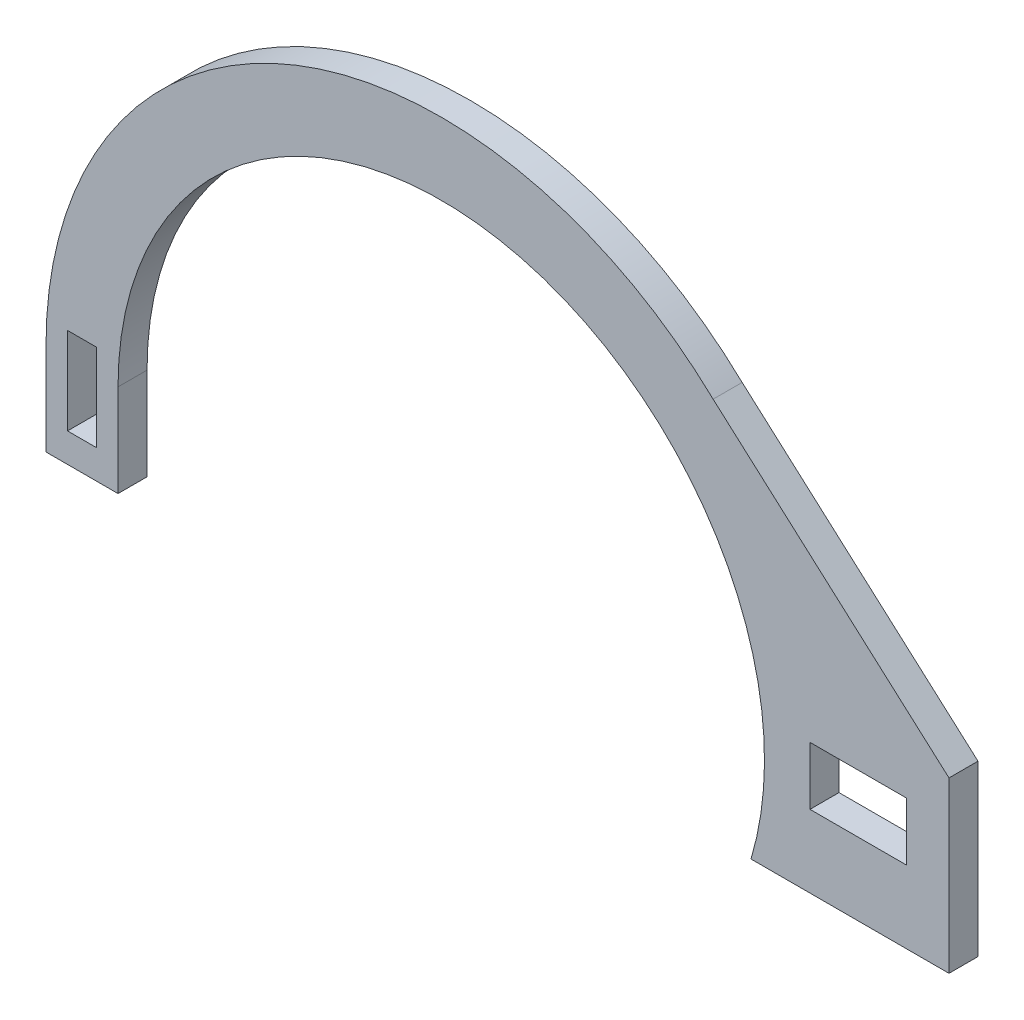
ISO-10303-21;
HEADER;
FILE_DESCRIPTION(('STEP AP214'),'2;1');
FILE_NAME('part.step','',(''),(''),'','','');
FILE_SCHEMA(('AUTOMOTIVE_DESIGN { 1 0 10303 214 1 1 1 1 }'));
ENDSEC;
DATA;
#1=APPLICATION_CONTEXT('core data for automotive mechanical design processes');
#2=APPLICATION_PROTOCOL_DEFINITION('international standard','automotive_design',2000,#1);
#3=PRODUCT_CONTEXT('',#1,'mechanical');
#4=PRODUCT('Part','Part','',(#3));
#5=PRODUCT_RELATED_PRODUCT_CATEGORY('part','',(#4));
#6=PRODUCT_DEFINITION_FORMATION('','',#4);
#7=PRODUCT_DEFINITION_CONTEXT('part definition',#1,'design');
#8=PRODUCT_DEFINITION('design','',#6,#7);
#9=PRODUCT_DEFINITION_SHAPE('','',#8);
#10=(LENGTH_UNIT() NAMED_UNIT(*) SI_UNIT(.MILLI.,.METRE.));
#11=(NAMED_UNIT(*) PLANE_ANGLE_UNIT() SI_UNIT($,.RADIAN.));
#12=(NAMED_UNIT(*) SI_UNIT($,.STERADIAN.) SOLID_ANGLE_UNIT());
#13=UNCERTAINTY_MEASURE_WITH_UNIT(LENGTH_MEASURE(1.E-05),#10,'distance_accuracy_value','');
#14=(GEOMETRIC_REPRESENTATION_CONTEXT(3) GLOBAL_UNCERTAINTY_ASSIGNED_CONTEXT((#13)) GLOBAL_UNIT_ASSIGNED_CONTEXT((#10,
#11,#12)) REPRESENTATION_CONTEXT('',''));
#15=CARTESIAN_POINT('',(0.,0.,0.));
#16=DIRECTION('',(0.,0.,1.));
#17=DIRECTION('',(1.,0.,0.));
#18=AXIS2_PLACEMENT_3D('',#15,#16,#17);
#19=CARTESIAN_POINT('',(106.428617247897,-40.2071343658743,6.));
#20=DIRECTION('',(0.,0.,1.));
#21=DIRECTION('',(1.,0.,0.));
#22=AXIS2_PLACEMENT_3D('',#19,#20,#21);
#23=PLANE('',#22);
#24=DIRECTION('',(0.,-1.,0.));
#25=VECTOR('',#24,1.);
#26=CARTESIAN_POINT('',(29.1338379448124,-40.2071343658743,6.));
#27=LINE('',#26,#25);
#28=CARTESIAN_POINT('',(29.1338379448124,-35.3177567250291,6.));
#29=VERTEX_POINT('',#28);
#30=CARTESIAN_POINT('',(29.1338379448124,-53.3177567250291,6.));
#31=VERTEX_POINT('',#30);
#32=EDGE_CURVE('E184',#29,#31,#27,.T.);
#33=ORIENTED_EDGE('',*,*,#32,.F.);
#34=DIRECTION('',(-1.,0.,0.));
#35=VECTOR('',#34,1.);
#36=CARTESIAN_POINT('',(106.428617247897,-35.3177567250291,6.));
#37=LINE('',#36,#35);
#38=CARTESIAN_POINT('',(35.1338379448124,-35.3177567250291,6.));
#39=VERTEX_POINT('',#38);
#40=EDGE_CURVE('E177',#39,#29,#37,.T.);
#41=ORIENTED_EDGE('',*,*,#40,.F.);
#42=DIRECTION('',(0.,1.,0.));
#43=VECTOR('',#42,1.);
#44=CARTESIAN_POINT('',(35.1338379448124,-40.2071343658743,6.));
#45=LINE('',#44,#43);
#46=CARTESIAN_POINT('',(35.1338379448124,-53.3177567250291,6.));
#47=VERTEX_POINT('',#46);
#48=EDGE_CURVE('E157',#47,#39,#45,.T.);
#49=ORIENTED_EDGE('',*,*,#48,.F.);
#50=DIRECTION('',(1.,0.,0.));
#51=VECTOR('',#50,1.);
#52=CARTESIAN_POINT('',(106.428617247897,-53.3177567250291,6.));
#53=LINE('',#52,#51);
#54=EDGE_CURVE('E182',#31,#47,#53,.T.);
#55=ORIENTED_EDGE('',*,*,#54,.F.);
#56=EDGE_LOOP('',(#33,#41,#49,#55));
#57=FACE_BOUND('',#56,.T.);
#58=CARTESIAN_POINT('',(106.428617247897,-40.2071343658743,6.));
#59=DIRECTION('',(0.,0.,-1.));
#60=DIRECTION('',(1.,0.,0.));
#61=AXIS2_PLACEMENT_3D('',#58,#59,#60);
#62=CIRCLE('',#61,66.8473215495736);
#63=CARTESIAN_POINT('',(39.5812956983237,-40.2071343658743,6.));
#64=VERTEX_POINT('',#63);
#65=CARTESIAN_POINT('',(170.486001766763,-59.317756725029,6.));
#66=VERTEX_POINT('',#65);
#67=EDGE_CURVE('E218',#64,#66,#62,.T.);
#68=ORIENTED_EDGE('',*,*,#67,.T.);
#69=DIRECTION('',(1.,0.,0.));
#70=VECTOR('',#69,1.);
#71=CARTESIAN_POINT('',(211.428617247897,-59.317756725029,6.));
#72=LINE('',#71,#70);
#73=CARTESIAN_POINT('',(211.428617247897,-59.317756725029,6.));
#74=VERTEX_POINT('',#73);
#75=EDGE_CURVE('E221',#66,#74,#72,.T.);
#76=ORIENTED_EDGE('',*,*,#75,.T.);
#77=DIRECTION('',(0.,1.,0.));
#78=VECTOR('',#77,1.);
#79=CARTESIAN_POINT('',(211.428617247897,-24.3177567250291,6.));
#80=LINE('',#79,#78);
#81=CARTESIAN_POINT('',(211.428617247897,-24.3177567250291,6.));
#82=VERTEX_POINT('',#81);
#83=EDGE_CURVE('E224',#74,#82,#80,.T.);
#84=ORIENTED_EDGE('',*,*,#83,.T.);
#85=DIRECTION('',(-0.746730434047933,0.665126799089155,0.));
#86=VECTOR('',#85,1.);
#87=CARTESIAN_POINT('',(211.428617247897,-24.3177567250291,6.));
#88=LINE('',#87,#86);
#89=CARTESIAN_POINT('',(162.653205503797,19.1274170731595,6.));
#90=VERTEX_POINT('',#89);
#91=EDGE_CURVE('E226',#82,#90,#88,.T.);
#92=ORIENTED_EDGE('',*,*,#91,.T.);
#93=CARTESIAN_POINT('',(106.428617247897,-40.2071343658743,6.));
#94=DIRECTION('',(0.,0.,1.));
#95=DIRECTION('',(1.,0.,0.));
#96=AXIS2_PLACEMENT_3D('',#93,#94,#95);
#97=CIRCLE('',#96,81.7422370565962);
#98=CARTESIAN_POINT('',(24.6863801913011,-40.2071343658743,6.));
#99=VERTEX_POINT('',#98);
#100=EDGE_CURVE('E228',#90,#99,#97,.T.);
#101=ORIENTED_EDGE('',*,*,#100,.T.);
#102=DIRECTION('',(0.,-1.,0.));
#103=VECTOR('',#102,1.);
#104=CARTESIAN_POINT('',(24.6863801913011,-40.2071343658743,6.));
#105=LINE('',#104,#103);
#106=CARTESIAN_POINT('',(24.6863801913012,-59.3177567250291,6.));
#107=VERTEX_POINT('',#106);
#108=EDGE_CURVE('E230',#99,#107,#105,.T.);
#109=ORIENTED_EDGE('',*,*,#108,.T.);
#110=DIRECTION('',(1.,0.,0.));
#111=VECTOR('',#110,1.);
#112=CARTESIAN_POINT('',(24.6863801913012,-59.3177567250291,6.));
#113=LINE('',#112,#111);
#114=CARTESIAN_POINT('',(39.5812956983237,-59.3177567250291,6.));
#115=VERTEX_POINT('',#114);
#116=EDGE_CURVE('E232',#107,#115,#113,.T.);
#117=ORIENTED_EDGE('',*,*,#116,.T.);
#118=DIRECTION('',(0.,1.,0.));
#119=VECTOR('',#118,1.);
#120=CARTESIAN_POINT('',(39.5812956983237,-40.2071343658743,6.));
#121=LINE('',#120,#119);
#122=EDGE_CURVE('E234',#115,#64,#121,.T.);
#123=ORIENTED_EDGE('',*,*,#122,.T.);
#124=EDGE_LOOP('',(#68,#76,#84,#92,#101,#109,#117,#123));
#125=FACE_BOUND('',#124,.T.);
#126=DIRECTION('',(-1.,0.,0.));
#127=VECTOR('',#126,1.);
#128=CARTESIAN_POINT('',(202.683627049338,-32.3177567250291,6.));
#129=LINE('',#128,#127);
#130=CARTESIAN_POINT('',(202.683627049338,-32.3177567250291,6.));
#131=VERTEX_POINT('',#130);
#132=CARTESIAN_POINT('',(182.683627049338,-32.3177567250291,6.));
#133=VERTEX_POINT('',#132);
#134=EDGE_CURVE('E189',#131,#133,#129,.T.);
#135=ORIENTED_EDGE('',*,*,#134,.F.);
#136=DIRECTION('',(0.,1.,0.));
#137=VECTOR('',#136,1.);
#138=CARTESIAN_POINT('',(202.683627049338,-32.3177567250291,6.));
#139=LINE('',#138,#137);
#140=CARTESIAN_POINT('',(202.683627049338,-44.3177567250291,6.));
#141=VERTEX_POINT('',#140);
#142=EDGE_CURVE('E187',#141,#131,#139,.T.);
#143=ORIENTED_EDGE('',*,*,#142,.F.);
#144=DIRECTION('',(1.,0.,0.));
#145=VECTOR('',#144,1.);
#146=CARTESIAN_POINT('',(202.683627049338,-44.3177567250291,6.));
#147=LINE('',#146,#145);
#148=CARTESIAN_POINT('',(182.683627049338,-44.3177567250291,6.));
#149=VERTEX_POINT('',#148);
#150=EDGE_CURVE('E195',#149,#141,#147,.T.);
#151=ORIENTED_EDGE('',*,*,#150,.F.);
#152=DIRECTION('',(0.,-1.,0.));
#153=VECTOR('',#152,1.);
#154=CARTESIAN_POINT('',(182.683627049338,-32.3177567250291,6.));
#155=LINE('',#154,#153);
#156=EDGE_CURVE('E192',#133,#149,#155,.T.);
#157=ORIENTED_EDGE('',*,*,#156,.F.);
#158=EDGE_LOOP('',(#135,#143,#151,#157));
#159=FACE_BOUND('',#158,.T.);
#160=ADVANCED_FACE('F38',(#57,#125,#159),#23,.T.);
#161=CARTESIAN_POINT('',(106.428617247897,-40.2071343658743,0.));
#162=DIRECTION('',(0.,0.,1.));
#163=DIRECTION('',(1.,0.,0.));
#164=AXIS2_PLACEMENT_3D('',#161,#162,#163);
#165=PLANE('',#164);
#166=DIRECTION('',(1.,0.,0.));
#167=VECTOR('',#166,1.);
#168=CARTESIAN_POINT('',(35.1338379448124,-35.3177567250291,0.));
#169=LINE('',#168,#167);
#170=CARTESIAN_POINT('',(29.1338379448124,-35.3177567250291,0.));
#171=VERTEX_POINT('',#170);
#172=CARTESIAN_POINT('',(35.1338379448124,-35.3177567250291,0.));
#173=VERTEX_POINT('',#172);
#174=EDGE_CURVE('E163',#171,#173,#169,.T.);
#175=ORIENTED_EDGE('',*,*,#174,.F.);
#176=DIRECTION('',(0.,1.,0.));
#177=VECTOR('',#176,1.);
#178=CARTESIAN_POINT('',(29.1338379448124,-35.3177567250291,0.));
#179=LINE('',#178,#177);
#180=CARTESIAN_POINT('',(29.1338379448124,-53.3177567250291,0.));
#181=VERTEX_POINT('',#180);
#182=EDGE_CURVE('E61',#181,#171,#179,.T.);
#183=ORIENTED_EDGE('',*,*,#182,.F.);
#184=DIRECTION('',(-1.,0.,0.));
#185=VECTOR('',#184,1.);
#186=CARTESIAN_POINT('',(35.1338379448124,-53.3177567250291,0.));
#187=LINE('',#186,#185);
#188=CARTESIAN_POINT('',(35.1338379448124,-53.3177567250291,0.));
#189=VERTEX_POINT('',#188);
#190=EDGE_CURVE('E170',#189,#181,#187,.T.);
#191=ORIENTED_EDGE('',*,*,#190,.F.);
#192=DIRECTION('',(0.,-1.,0.));
#193=VECTOR('',#192,1.);
#194=CARTESIAN_POINT('',(35.1338379448124,-35.3177567250291,0.));
#195=LINE('',#194,#193);
#196=EDGE_CURVE('E154',#173,#189,#195,.T.);
#197=ORIENTED_EDGE('',*,*,#196,.F.);
#198=EDGE_LOOP('',(#175,#183,#191,#197));
#199=FACE_BOUND('',#198,.T.);
#200=CARTESIAN_POINT('',(106.428617247897,-40.2071343658743,0.));
#201=DIRECTION('',(0.,0.,-1.));
#202=DIRECTION('',(1.,0.,0.));
#203=AXIS2_PLACEMENT_3D('',#200,#201,#202);
#204=CIRCLE('',#203,66.8473215495736);
#205=CARTESIAN_POINT('',(39.5812956983237,-40.2071343658743,0.));
#206=VERTEX_POINT('',#205);
#207=CARTESIAN_POINT('',(170.486001766763,-59.317756725029,0.));
#208=VERTEX_POINT('',#207);
#209=EDGE_CURVE('E217',#206,#208,#204,.T.);
#210=ORIENTED_EDGE('',*,*,#209,.F.);
#211=DIRECTION('',(0.,1.,0.));
#212=VECTOR('',#211,1.);
#213=CARTESIAN_POINT('',(39.5812956983237,-40.2071343658743,0.));
#214=LINE('',#213,#212);
#215=CARTESIAN_POINT('',(39.5812956983237,-59.3177567250291,0.));
#216=VERTEX_POINT('',#215);
#217=EDGE_CURVE('E222',#216,#206,#214,.T.);
#218=ORIENTED_EDGE('',*,*,#217,.F.);
#219=DIRECTION('',(1.,0.,0.));
#220=VECTOR('',#219,1.);
#221=CARTESIAN_POINT('',(24.6863801913012,-59.3177567250291,0.));
#222=LINE('',#221,#220);
#223=CARTESIAN_POINT('',(24.6863801913012,-59.3177567250291,0.));
#224=VERTEX_POINT('',#223);
#225=EDGE_CURVE('E249',#224,#216,#222,.T.);
#226=ORIENTED_EDGE('',*,*,#225,.F.);
#227=DIRECTION('',(0.,-1.,0.));
#228=VECTOR('',#227,1.);
#229=CARTESIAN_POINT('',(24.6863801913011,-40.2071343658743,0.));
#230=LINE('',#229,#228);
#231=CARTESIAN_POINT('',(24.6863801913011,-40.2071343658743,0.));
#232=VERTEX_POINT('',#231);
#233=EDGE_CURVE('E247',#232,#224,#230,.T.);
#234=ORIENTED_EDGE('',*,*,#233,.F.);
#235=CARTESIAN_POINT('',(106.428617247897,-40.2071343658743,0.));
#236=DIRECTION('',(0.,0.,1.));
#237=DIRECTION('',(1.,0.,0.));
#238=AXIS2_PLACEMENT_3D('',#235,#236,#237);
#239=CIRCLE('',#238,81.7422370565962);
#240=CARTESIAN_POINT('',(162.653205503797,19.1274170731595,0.));
#241=VERTEX_POINT('',#240);
#242=EDGE_CURVE('E245',#241,#232,#239,.T.);
#243=ORIENTED_EDGE('',*,*,#242,.F.);
#244=DIRECTION('',(-0.746730434047933,0.665126799089155,0.));
#245=VECTOR('',#244,1.);
#246=CARTESIAN_POINT('',(211.428617247897,-24.3177567250291,0.));
#247=LINE('',#246,#245);
#248=CARTESIAN_POINT('',(211.428617247897,-24.3177567250291,0.));
#249=VERTEX_POINT('',#248);
#250=EDGE_CURVE('E243',#249,#241,#247,.T.);
#251=ORIENTED_EDGE('',*,*,#250,.F.);
#252=DIRECTION('',(0.,1.,0.));
#253=VECTOR('',#252,1.);
#254=CARTESIAN_POINT('',(211.428617247897,-24.3177567250291,0.));
#255=LINE('',#254,#253);
#256=CARTESIAN_POINT('',(211.428617247897,-59.317756725029,0.));
#257=VERTEX_POINT('',#256);
#258=EDGE_CURVE('E241',#257,#249,#255,.T.);
#259=ORIENTED_EDGE('',*,*,#258,.F.);
#260=DIRECTION('',(1.,0.,0.));
#261=VECTOR('',#260,1.);
#262=CARTESIAN_POINT('',(211.428617247897,-59.317756725029,0.));
#263=LINE('',#262,#261);
#264=EDGE_CURVE('E239',#208,#257,#263,.T.);
#265=ORIENTED_EDGE('',*,*,#264,.F.);
#266=EDGE_LOOP('',(#210,#218,#226,#234,#243,#251,#259,#265));
#267=FACE_BOUND('',#266,.T.);
#268=DIRECTION('',(0.,1.,0.));
#269=VECTOR('',#268,1.);
#270=CARTESIAN_POINT('',(202.683627049338,-32.3177567250291,0.));
#271=LINE('',#270,#269);
#272=CARTESIAN_POINT('',(202.683627049338,-44.3177567250291,0.));
#273=VERTEX_POINT('',#272);
#274=CARTESIAN_POINT('',(202.683627049338,-32.3177567250291,0.));
#275=VERTEX_POINT('',#274);
#276=EDGE_CURVE('E186',#273,#275,#271,.T.);
#277=ORIENTED_EDGE('',*,*,#276,.T.);
#278=DIRECTION('',(-1.,0.,0.));
#279=VECTOR('',#278,1.);
#280=CARTESIAN_POINT('',(202.683627049338,-32.3177567250291,0.));
#281=LINE('',#280,#279);
#282=CARTESIAN_POINT('',(182.683627049338,-32.3177567250291,0.));
#283=VERTEX_POINT('',#282);
#284=EDGE_CURVE('E200',#275,#283,#281,.T.);
#285=ORIENTED_EDGE('',*,*,#284,.T.);
#286=DIRECTION('',(0.,-1.,0.));
#287=VECTOR('',#286,1.);
#288=CARTESIAN_POINT('',(182.683627049338,-32.3177567250291,0.));
#289=LINE('',#288,#287);
#290=CARTESIAN_POINT('',(182.683627049338,-44.3177567250291,0.));
#291=VERTEX_POINT('',#290);
#292=EDGE_CURVE('E203',#283,#291,#289,.T.);
#293=ORIENTED_EDGE('',*,*,#292,.T.);
#294=DIRECTION('',(1.,0.,0.));
#295=VECTOR('',#294,1.);
#296=CARTESIAN_POINT('',(202.683627049338,-44.3177567250291,0.));
#297=LINE('',#296,#295);
#298=EDGE_CURVE('E190',#291,#273,#297,.T.);
#299=ORIENTED_EDGE('',*,*,#298,.T.);
#300=EDGE_LOOP('',(#277,#285,#293,#299));
#301=FACE_BOUND('',#300,.T.);
#302=ADVANCED_FACE('F167',(#199,#267,#301),#165,.F.);
#303=CARTESIAN_POINT('',(106.428617247897,-40.2071343658743,6.));
#304=DIRECTION('',(0.,0.,-1.));
#305=DIRECTION('',(-1.,0.,0.));
#306=AXIS2_PLACEMENT_3D('',#303,#304,#305);
#307=CYLINDRICAL_SURFACE('',#306,66.8473215495736);
#308=ORIENTED_EDGE('',*,*,#209,.T.);
#309=DIRECTION('',(0.,0.,-1.));
#310=VECTOR('',#309,1.);
#311=CARTESIAN_POINT('',(170.486001766763,-59.317756725029,6.));
#312=LINE('',#311,#310);
#313=EDGE_CURVE('E11',#66,#208,#312,.T.);
#314=ORIENTED_EDGE('',*,*,#313,.F.);
#315=ORIENTED_EDGE('',*,*,#67,.F.);
#316=DIRECTION('',(0.,0.,-1.));
#317=VECTOR('',#316,1.);
#318=CARTESIAN_POINT('',(39.5812956983237,-40.2071343658743,6.));
#319=LINE('',#318,#317);
#320=EDGE_CURVE('E236',#64,#206,#319,.T.);
#321=ORIENTED_EDGE('',*,*,#320,.T.);
#322=EDGE_LOOP('',(#308,#314,#315,#321));
#323=FACE_BOUND('',#322,.T.);
#324=ADVANCED_FACE('F40',(#323),#307,.F.);
#325=CARTESIAN_POINT('',(211.428617247897,-59.317756725029,6.));
#326=DIRECTION('',(0.,1.,0.));
#327=DIRECTION('',(0.,0.,1.));
#328=AXIS2_PLACEMENT_3D('',#325,#326,#327);
#329=PLANE('',#328);
#330=ORIENTED_EDGE('',*,*,#264,.T.);
#331=DIRECTION('',(0.,0.,-1.));
#332=VECTOR('',#331,1.);
#333=CARTESIAN_POINT('',(211.428617247897,-59.317756725029,6.));
#334=LINE('',#333,#332);
#335=EDGE_CURVE('E46',#74,#257,#334,.T.);
#336=ORIENTED_EDGE('',*,*,#335,.F.);
#337=ORIENTED_EDGE('',*,*,#75,.F.);
#338=ORIENTED_EDGE('',*,*,#313,.T.);
#339=EDGE_LOOP('',(#330,#336,#337,#338));
#340=FACE_BOUND('',#339,.T.);
#341=ADVANCED_FACE('F295',(#340),#329,.F.);
#342=CARTESIAN_POINT('',(211.428617247897,-24.3177567250291,6.));
#343=DIRECTION('',(-1.,0.,0.));
#344=DIRECTION('',(0.,0.,1.));
#345=AXIS2_PLACEMENT_3D('',#342,#343,#344);
#346=PLANE('',#345);
#347=ORIENTED_EDGE('',*,*,#258,.T.);
#348=DIRECTION('',(0.,0.,-1.));
#349=VECTOR('',#348,1.);
#350=CARTESIAN_POINT('',(211.428617247897,-24.3177567250291,6.));
#351=LINE('',#350,#349);
#352=EDGE_CURVE('E266',#82,#249,#351,.T.);
#353=ORIENTED_EDGE('',*,*,#352,.F.);
#354=ORIENTED_EDGE('',*,*,#83,.F.);
#355=ORIENTED_EDGE('',*,*,#335,.T.);
#356=EDGE_LOOP('',(#347,#353,#354,#355));
#357=FACE_BOUND('',#356,.T.);
#358=ADVANCED_FACE('F273',(#357),#346,.F.);
#359=CARTESIAN_POINT('',(211.428617247897,-24.3177567250291,6.));
#360=DIRECTION('',(-0.665126799089155,-0.746730434047933,0.));
#361=DIRECTION('',(0.746730434047933,-0.665126799089155,0.));
#362=AXIS2_PLACEMENT_3D('',#359,#360,#361);
#363=PLANE('',#362);
#364=ORIENTED_EDGE('',*,*,#250,.T.);
#365=DIRECTION('',(0.,0.,-1.));
#366=VECTOR('',#365,1.);
#367=CARTESIAN_POINT('',(162.653205503797,19.1274170731595,6.));
#368=LINE('',#367,#366);
#369=EDGE_CURVE('E263',#90,#241,#368,.T.);
#370=ORIENTED_EDGE('',*,*,#369,.F.);
#371=ORIENTED_EDGE('',*,*,#91,.F.);
#372=ORIENTED_EDGE('',*,*,#352,.T.);
#373=EDGE_LOOP('',(#364,#370,#371,#372));
#374=FACE_BOUND('',#373,.T.);
#375=ADVANCED_FACE('F283',(#374),#363,.F.);
#376=CARTESIAN_POINT('',(106.428617247897,-40.2071343658743,6.));
#377=DIRECTION('',(0.,0.,-1.));
#378=DIRECTION('',(-1.,0.,0.));
#379=AXIS2_PLACEMENT_3D('',#376,#377,#378);
#380=CYLINDRICAL_SURFACE('',#379,81.7422370565962);
#381=ORIENTED_EDGE('',*,*,#242,.T.);
#382=DIRECTION('',(0.,0.,-1.));
#383=VECTOR('',#382,1.);
#384=CARTESIAN_POINT('',(24.6863801913011,-40.2071343658743,6.));
#385=LINE('',#384,#383);
#386=EDGE_CURVE('E260',#99,#232,#385,.T.);
#387=ORIENTED_EDGE('',*,*,#386,.F.);
#388=ORIENTED_EDGE('',*,*,#100,.F.);
#389=ORIENTED_EDGE('',*,*,#369,.T.);
#390=EDGE_LOOP('',(#381,#387,#388,#389));
#391=FACE_BOUND('',#390,.T.);
#392=ADVANCED_FACE('F287',(#391),#380,.T.);
#393=CARTESIAN_POINT('',(24.6863801913011,-40.2071343658743,6.));
#394=DIRECTION('',(1.,0.,0.));
#395=DIRECTION('',(0.,1.,0.));
#396=AXIS2_PLACEMENT_3D('',#393,#394,#395);
#397=PLANE('',#396);
#398=ORIENTED_EDGE('',*,*,#233,.T.);
#399=DIRECTION('',(0.,0.,-1.));
#400=VECTOR('',#399,1.);
#401=CARTESIAN_POINT('',(24.6863801913012,-59.3177567250291,6.));
#402=LINE('',#401,#400);
#403=EDGE_CURVE('E257',#107,#224,#402,.T.);
#404=ORIENTED_EDGE('',*,*,#403,.F.);
#405=ORIENTED_EDGE('',*,*,#108,.F.);
#406=ORIENTED_EDGE('',*,*,#386,.T.);
#407=EDGE_LOOP('',(#398,#404,#405,#406));
#408=FACE_BOUND('',#407,.T.);
#409=ADVANCED_FACE('F308',(#408),#397,.F.);
#410=CARTESIAN_POINT('',(24.6863801913012,-59.3177567250291,6.));
#411=DIRECTION('',(0.,1.,0.));
#412=DIRECTION('',(0.,0.,1.));
#413=AXIS2_PLACEMENT_3D('',#410,#411,#412);
#414=PLANE('',#413);
#415=ORIENTED_EDGE('',*,*,#225,.T.);
#416=DIRECTION('',(0.,0.,-1.));
#417=VECTOR('',#416,1.);
#418=CARTESIAN_POINT('',(39.5812956983237,-59.3177567250291,6.));
#419=LINE('',#418,#417);
#420=EDGE_CURVE('E254',#115,#216,#419,.T.);
#421=ORIENTED_EDGE('',*,*,#420,.F.);
#422=ORIENTED_EDGE('',*,*,#116,.F.);
#423=ORIENTED_EDGE('',*,*,#403,.T.);
#424=EDGE_LOOP('',(#415,#421,#422,#423));
#425=FACE_BOUND('',#424,.T.);
#426=ADVANCED_FACE('F306',(#425),#414,.F.);
#427=CARTESIAN_POINT('',(39.5812956983237,-40.2071343658743,6.));
#428=DIRECTION('',(-1.,0.,0.));
#429=DIRECTION('',(0.,0.,1.));
#430=AXIS2_PLACEMENT_3D('',#427,#428,#429);
#431=PLANE('',#430);
#432=ORIENTED_EDGE('',*,*,#217,.T.);
#433=ORIENTED_EDGE('',*,*,#320,.F.);
#434=ORIENTED_EDGE('',*,*,#122,.F.);
#435=ORIENTED_EDGE('',*,*,#420,.T.);
#436=EDGE_LOOP('',(#432,#433,#434,#435));
#437=FACE_BOUND('',#436,.T.);
#438=ADVANCED_FACE('F301',(#437),#431,.F.);
#439=CARTESIAN_POINT('',(202.683627049338,-32.3177567250291,6.));
#440=DIRECTION('',(-1.,0.,0.));
#441=DIRECTION('',(0.,0.,1.));
#442=AXIS2_PLACEMENT_3D('',#439,#440,#441);
#443=PLANE('',#442);
#444=ORIENTED_EDGE('',*,*,#276,.F.);
#445=DIRECTION('',(0.,0.,-1.));
#446=VECTOR('',#445,1.);
#447=CARTESIAN_POINT('',(202.683627049338,-44.3177567250291,6.));
#448=LINE('',#447,#446);
#449=EDGE_CURVE('E197',#141,#273,#448,.T.);
#450=ORIENTED_EDGE('',*,*,#449,.F.);
#451=ORIENTED_EDGE('',*,*,#142,.T.);
#452=DIRECTION('',(0.,0.,-1.));
#453=VECTOR('',#452,1.);
#454=CARTESIAN_POINT('',(202.683627049338,-32.3177567250291,6.));
#455=LINE('',#454,#453);
#456=EDGE_CURVE('E214',#131,#275,#455,.T.);
#457=ORIENTED_EDGE('',*,*,#456,.T.);
#458=EDGE_LOOP('',(#444,#450,#451,#457));
#459=FACE_BOUND('',#458,.T.);
#460=ADVANCED_FACE('F327',(#459),#443,.T.);
#461=CARTESIAN_POINT('',(202.683627049338,-32.3177567250291,6.));
#462=DIRECTION('',(0.,-1.,0.));
#463=DIRECTION('',(0.,0.,-1.));
#464=AXIS2_PLACEMENT_3D('',#461,#462,#463);
#465=PLANE('',#464);
#466=ORIENTED_EDGE('',*,*,#284,.F.);
#467=ORIENTED_EDGE('',*,*,#456,.F.);
#468=ORIENTED_EDGE('',*,*,#134,.T.);
#469=DIRECTION('',(0.,0.,-1.));
#470=VECTOR('',#469,1.);
#471=CARTESIAN_POINT('',(182.683627049338,-32.3177567250291,6.));
#472=LINE('',#471,#470);
#473=EDGE_CURVE('E212',#133,#283,#472,.T.);
#474=ORIENTED_EDGE('',*,*,#473,.T.);
#475=EDGE_LOOP('',(#466,#467,#468,#474));
#476=FACE_BOUND('',#475,.T.);
#477=ADVANCED_FACE('F334',(#476),#465,.T.);
#478=CARTESIAN_POINT('',(182.683627049338,-32.3177567250291,6.));
#479=DIRECTION('',(1.,0.,0.));
#480=DIRECTION('',(0.,0.,-1.));
#481=AXIS2_PLACEMENT_3D('',#478,#479,#480);
#482=PLANE('',#481);
#483=ORIENTED_EDGE('',*,*,#292,.F.);
#484=ORIENTED_EDGE('',*,*,#473,.F.);
#485=ORIENTED_EDGE('',*,*,#156,.T.);
#486=DIRECTION('',(0.,0.,-1.));
#487=VECTOR('',#486,1.);
#488=CARTESIAN_POINT('',(182.683627049338,-44.3177567250291,6.));
#489=LINE('',#488,#487);
#490=EDGE_CURVE('E210',#149,#291,#489,.T.);
#491=ORIENTED_EDGE('',*,*,#490,.T.);
#492=EDGE_LOOP('',(#483,#484,#485,#491));
#493=FACE_BOUND('',#492,.T.);
#494=ADVANCED_FACE('F339',(#493),#482,.T.);
#495=CARTESIAN_POINT('',(202.683627049338,-44.3177567250291,6.));
#496=DIRECTION('',(0.,1.,0.));
#497=DIRECTION('',(-1.,0.,0.));
#498=AXIS2_PLACEMENT_3D('',#495,#496,#497);
#499=PLANE('',#498);
#500=ORIENTED_EDGE('',*,*,#298,.F.);
#501=ORIENTED_EDGE('',*,*,#490,.F.);
#502=ORIENTED_EDGE('',*,*,#150,.T.);
#503=ORIENTED_EDGE('',*,*,#449,.T.);
#504=EDGE_LOOP('',(#500,#501,#502,#503));
#505=FACE_BOUND('',#504,.T.);
#506=ADVANCED_FACE('F346',(#505),#499,.T.);
#507=CARTESIAN_POINT('',(29.1338379448124,-35.3177567250291,10.));
#508=DIRECTION('',(-1.,0.,0.));
#509=DIRECTION('',(0.,-1.,0.));
#510=AXIS2_PLACEMENT_3D('',#507,#508,#509);
#511=PLANE('',#510);
#512=ORIENTED_EDGE('',*,*,#32,.T.);
#513=DIRECTION('',(0.,0.,-1.));
#514=VECTOR('',#513,1.);
#515=CARTESIAN_POINT('',(29.1338379448124,-53.3177567250291,10.));
#516=LINE('',#515,#514);
#517=EDGE_CURVE('E175',#31,#181,#516,.T.);
#518=ORIENTED_EDGE('',*,*,#517,.T.);
#519=ORIENTED_EDGE('',*,*,#182,.T.);
#520=DIRECTION('',(0.,0.,-1.));
#521=VECTOR('',#520,1.);
#522=CARTESIAN_POINT('',(29.1338379448124,-35.3177567250291,10.));
#523=LINE('',#522,#521);
#524=EDGE_CURVE('E160',#29,#171,#523,.T.);
#525=ORIENTED_EDGE('',*,*,#524,.F.);
#526=EDGE_LOOP('',(#512,#518,#519,#525));
#527=FACE_BOUND('',#526,.T.);
#528=ADVANCED_FACE('F358',(#527),#511,.F.);
#529=CARTESIAN_POINT('',(35.1338379448124,-53.3177567250291,10.));
#530=DIRECTION('',(0.,-1.,0.));
#531=DIRECTION('',(0.,0.,-1.));
#532=AXIS2_PLACEMENT_3D('',#529,#530,#531);
#533=PLANE('',#532);
#534=ORIENTED_EDGE('',*,*,#54,.T.);
#535=DIRECTION('',(0.,0.,-1.));
#536=VECTOR('',#535,1.);
#537=CARTESIAN_POINT('',(35.1338379448124,-53.3177567250291,10.));
#538=LINE('',#537,#536);
#539=EDGE_CURVE('E159',#47,#189,#538,.T.);
#540=ORIENTED_EDGE('',*,*,#539,.T.);
#541=ORIENTED_EDGE('',*,*,#190,.T.);
#542=ORIENTED_EDGE('',*,*,#517,.F.);
#543=EDGE_LOOP('',(#534,#540,#541,#542));
#544=FACE_BOUND('',#543,.T.);
#545=ADVANCED_FACE('F363',(#544),#533,.F.);
#546=CARTESIAN_POINT('',(35.1338379448124,-35.3177567250291,10.));
#547=DIRECTION('',(1.,0.,0.));
#548=DIRECTION('',(0.,0.,-1.));
#549=AXIS2_PLACEMENT_3D('',#546,#547,#548);
#550=PLANE('',#549);
#551=ORIENTED_EDGE('',*,*,#48,.T.);
#552=DIRECTION('',(0.,0.,-1.));
#553=VECTOR('',#552,1.);
#554=CARTESIAN_POINT('',(35.1338379448124,-35.3177567250291,10.));
#555=LINE('',#554,#553);
#556=EDGE_CURVE('E53',#39,#173,#555,.T.);
#557=ORIENTED_EDGE('',*,*,#556,.T.);
#558=ORIENTED_EDGE('',*,*,#196,.T.);
#559=ORIENTED_EDGE('',*,*,#539,.F.);
#560=EDGE_LOOP('',(#551,#557,#558,#559));
#561=FACE_BOUND('',#560,.T.);
#562=ADVANCED_FACE('F151',(#561),#550,.F.);
#563=CARTESIAN_POINT('',(35.1338379448124,-35.3177567250291,10.));
#564=DIRECTION('',(0.,1.,0.));
#565=DIRECTION('',(0.,0.,1.));
#566=AXIS2_PLACEMENT_3D('',#563,#564,#565);
#567=PLANE('',#566);
#568=ORIENTED_EDGE('',*,*,#40,.T.);
#569=ORIENTED_EDGE('',*,*,#524,.T.);
#570=ORIENTED_EDGE('',*,*,#174,.T.);
#571=ORIENTED_EDGE('',*,*,#556,.F.);
#572=EDGE_LOOP('',(#568,#569,#570,#571));
#573=FACE_BOUND('',#572,.T.);
#574=ADVANCED_FACE('F164',(#573),#567,.F.);
#575=CLOSED_SHELL('',(#160,#302,#324,#341,#358,#375,#392,#409,#426,#438,#460,#477,#494,#506,
#528,#545,#562,#574));
#576=MANIFOLD_SOLID_BREP('B2',#575);
#577=ADVANCED_BREP_SHAPE_REPRESENTATION('',(#18,#576),#14);
#578=SHAPE_DEFINITION_REPRESENTATION(#9,#577);
ENDSEC;
END-ISO-10303-21;
